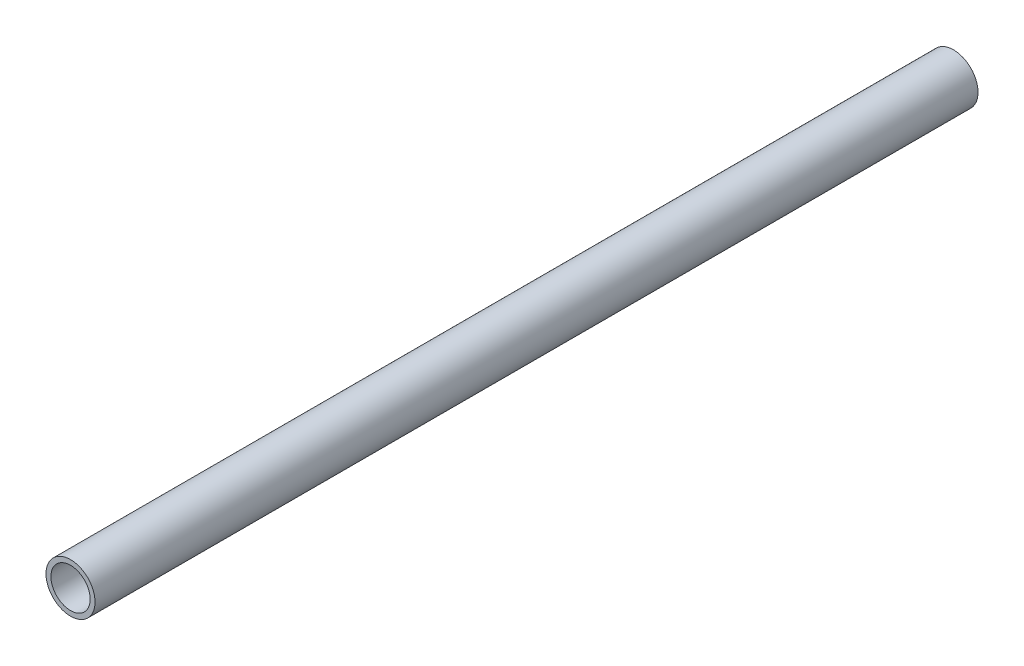
ISO-10303-21;
HEADER;
FILE_DESCRIPTION(('STEP AP214'),'2;1');
FILE_NAME('part.step','',(''),(''),'','','');
FILE_SCHEMA(('AUTOMOTIVE_DESIGN { 1 0 10303 214 1 1 1 1 }'));
ENDSEC;
DATA;
#1=APPLICATION_CONTEXT('core data for automotive mechanical design processes');
#2=APPLICATION_PROTOCOL_DEFINITION('international standard','automotive_design',2000,#1);
#3=PRODUCT_CONTEXT('',#1,'mechanical');
#4=PRODUCT('Part','Part','',(#3));
#5=PRODUCT_RELATED_PRODUCT_CATEGORY('part','',(#4));
#6=PRODUCT_DEFINITION_FORMATION('','',#4);
#7=PRODUCT_DEFINITION_CONTEXT('part definition',#1,'design');
#8=PRODUCT_DEFINITION('design','',#6,#7);
#9=PRODUCT_DEFINITION_SHAPE('','',#8);
#10=(LENGTH_UNIT() NAMED_UNIT(*) SI_UNIT(.MILLI.,.METRE.));
#11=(NAMED_UNIT(*) PLANE_ANGLE_UNIT() SI_UNIT($,.RADIAN.));
#12=(NAMED_UNIT(*) SI_UNIT($,.STERADIAN.) SOLID_ANGLE_UNIT());
#13=UNCERTAINTY_MEASURE_WITH_UNIT(LENGTH_MEASURE(1.E-05),#10,'distance_accuracy_value','');
#14=(GEOMETRIC_REPRESENTATION_CONTEXT(3) GLOBAL_UNCERTAINTY_ASSIGNED_CONTEXT((#13)) GLOBAL_UNIT_ASSIGNED_CONTEXT((#10,
#11,#12)) REPRESENTATION_CONTEXT('',''));
#15=CARTESIAN_POINT('',(0.,0.,0.));
#16=DIRECTION('',(0.,0.,1.));
#17=DIRECTION('',(1.,0.,0.));
#18=AXIS2_PLACEMENT_3D('',#15,#16,#17);
#19=CARTESIAN_POINT('',(0.,0.,180.));
#20=DIRECTION('',(0.,0.,1.));
#21=DIRECTION('',(1.,0.,0.));
#22=AXIS2_PLACEMENT_3D('',#19,#20,#21);
#23=PLANE('',#22);
#24=CARTESIAN_POINT('',(0.,0.,180.));
#25=DIRECTION('',(0.,0.,1.));
#26=DIRECTION('',(1.,0.,0.));
#27=AXIS2_PLACEMENT_3D('',#24,#25,#26);
#28=CIRCLE('',#27,5.);
#29=CARTESIAN_POINT('',(-5.,0.,180.));
#30=VERTEX_POINT('',#29);
#31=EDGE_CURVE('E10',#30,#30,#28,.T.);
#32=ORIENTED_EDGE('',*,*,#31,.T.);
#33=EDGE_LOOP('',(#32));
#34=FACE_BOUND('',#33,.T.);
#35=CARTESIAN_POINT('',(0.,0.,180.));
#36=DIRECTION('',(0.,0.,1.));
#37=DIRECTION('',(1.,0.,0.));
#38=AXIS2_PLACEMENT_3D('',#35,#36,#37);
#39=CIRCLE('',#38,4.);
#40=CARTESIAN_POINT('',(-4.,0.,180.));
#41=VERTEX_POINT('',#40);
#42=EDGE_CURVE('E44',#41,#41,#39,.T.);
#43=ORIENTED_EDGE('',*,*,#42,.F.);
#44=EDGE_LOOP('',(#43));
#45=FACE_BOUND('',#44,.T.);
#46=ADVANCED_FACE('F33',(#34,#45),#23,.T.);
#47=CARTESIAN_POINT('',(0.,0.,0.));
#48=DIRECTION('',(0.,0.,1.));
#49=DIRECTION('',(1.,0.,0.));
#50=AXIS2_PLACEMENT_3D('',#47,#48,#49);
#51=PLANE('',#50);
#52=CARTESIAN_POINT('',(0.,0.,0.));
#53=DIRECTION('',(0.,0.,1.));
#54=DIRECTION('',(1.,0.,0.));
#55=AXIS2_PLACEMENT_3D('',#52,#53,#54);
#56=CIRCLE('',#55,5.);
#57=CARTESIAN_POINT('',(-5.,0.,0.));
#58=VERTEX_POINT('',#57);
#59=EDGE_CURVE('E37',#58,#58,#56,.T.);
#60=ORIENTED_EDGE('',*,*,#59,.F.);
#61=EDGE_LOOP('',(#60));
#62=FACE_BOUND('',#61,.T.);
#63=CARTESIAN_POINT('',(0.,0.,0.));
#64=DIRECTION('',(0.,0.,1.));
#65=DIRECTION('',(1.,0.,0.));
#66=AXIS2_PLACEMENT_3D('',#63,#64,#65);
#67=CIRCLE('',#66,4.);
#68=CARTESIAN_POINT('',(-4.,0.,0.));
#69=VERTEX_POINT('',#68);
#70=EDGE_CURVE('E46',#69,#69,#67,.T.);
#71=ORIENTED_EDGE('',*,*,#70,.T.);
#72=EDGE_LOOP('',(#71));
#73=FACE_BOUND('',#72,.T.);
#74=ADVANCED_FACE('F56',(#62,#73),#51,.F.);
#75=CARTESIAN_POINT('',(0.,0.,180.));
#76=DIRECTION('',(0.,0.,-1.));
#77=DIRECTION('',(-1.,0.,0.));
#78=AXIS2_PLACEMENT_3D('',#75,#76,#77);
#79=CYLINDRICAL_SURFACE('',#78,5.);
#80=CARTESIAN_POINT('',(-5.,0.,180.));
#81=CARTESIAN_POINT('',(-5.,0.,178.125));
#82=CARTESIAN_POINT('',(-5.,0.,176.25));
#83=CARTESIAN_POINT('',(-5.,0.,172.5));
#84=CARTESIAN_POINT('',(-5.,0.,170.625));
#85=CARTESIAN_POINT('',(-5.,0.,166.875));
#86=CARTESIAN_POINT('',(-5.,0.,165.));
#87=CARTESIAN_POINT('',(-5.,0.,161.25));
#88=CARTESIAN_POINT('',(-5.,0.,159.375));
#89=CARTESIAN_POINT('',(-5.,0.,155.625));
#90=CARTESIAN_POINT('',(-5.,0.,153.75));
#91=CARTESIAN_POINT('',(-5.,0.,150.));
#92=CARTESIAN_POINT('',(-5.,0.,148.125));
#93=CARTESIAN_POINT('',(-5.,0.,144.375));
#94=CARTESIAN_POINT('',(-5.,0.,142.5));
#95=CARTESIAN_POINT('',(-5.,0.,138.75));
#96=CARTESIAN_POINT('',(-5.,0.,136.875));
#97=CARTESIAN_POINT('',(-5.,0.,133.125));
#98=CARTESIAN_POINT('',(-5.,0.,131.25));
#99=CARTESIAN_POINT('',(-5.,0.,127.5));
#100=CARTESIAN_POINT('',(-5.,0.,125.625));
#101=CARTESIAN_POINT('',(-5.,0.,121.875));
#102=CARTESIAN_POINT('',(-5.,0.,120.));
#103=CARTESIAN_POINT('',(-5.,0.,116.25));
#104=CARTESIAN_POINT('',(-5.,0.,114.375));
#105=CARTESIAN_POINT('',(-5.,0.,110.625));
#106=CARTESIAN_POINT('',(-5.,0.,108.75));
#107=CARTESIAN_POINT('',(-5.,0.,105.));
#108=CARTESIAN_POINT('',(-5.,0.,103.125));
#109=CARTESIAN_POINT('',(-5.,0.,99.375));
#110=CARTESIAN_POINT('',(-5.,0.,97.5));
#111=CARTESIAN_POINT('',(-5.,0.,93.75));
#112=CARTESIAN_POINT('',(-5.,0.,91.875));
#113=CARTESIAN_POINT('',(-5.,0.,88.125));
#114=CARTESIAN_POINT('',(-5.,0.,86.25));
#115=CARTESIAN_POINT('',(-5.,0.,82.5));
#116=CARTESIAN_POINT('',(-5.,0.,80.625));
#117=CARTESIAN_POINT('',(-5.,0.,76.875));
#118=CARTESIAN_POINT('',(-5.,0.,75.));
#119=CARTESIAN_POINT('',(-5.,0.,71.25));
#120=CARTESIAN_POINT('',(-5.,0.,69.375));
#121=CARTESIAN_POINT('',(-5.,0.,65.625));
#122=CARTESIAN_POINT('',(-5.,0.,63.75));
#123=CARTESIAN_POINT('',(-5.,0.,60.));
#124=CARTESIAN_POINT('',(-5.,0.,58.125));
#125=CARTESIAN_POINT('',(-5.,0.,54.375));
#126=CARTESIAN_POINT('',(-5.,0.,52.5));
#127=CARTESIAN_POINT('',(-5.,0.,48.75));
#128=CARTESIAN_POINT('',(-5.,0.,46.875));
#129=CARTESIAN_POINT('',(-5.,0.,43.125));
#130=CARTESIAN_POINT('',(-5.,0.,41.25));
#131=CARTESIAN_POINT('',(-5.,0.,37.5));
#132=CARTESIAN_POINT('',(-5.,0.,35.625));
#133=CARTESIAN_POINT('',(-5.,0.,31.875));
#134=CARTESIAN_POINT('',(-5.,0.,30.));
#135=CARTESIAN_POINT('',(-5.,0.,26.25));
#136=CARTESIAN_POINT('',(-5.,0.,24.375));
#137=CARTESIAN_POINT('',(-5.,0.,20.625));
#138=CARTESIAN_POINT('',(-5.,0.,18.75));
#139=CARTESIAN_POINT('',(-5.,0.,15.));
#140=CARTESIAN_POINT('',(-5.,0.,13.125));
#141=CARTESIAN_POINT('',(-5.,0.,9.37499999999998));
#142=CARTESIAN_POINT('',(-5.,0.,7.49999999999997));
#143=CARTESIAN_POINT('',(-5.,0.,3.74999999999997));
#144=CARTESIAN_POINT('',(-5.,0.,1.87499999999997));
#145=CARTESIAN_POINT('',(-5.,0.,0.));
#146=B_SPLINE_CURVE_WITH_KNOTS('',3,(#80,#81,#82,#83,#84,#85,#86,#87,#88,#89,#90,#91,#92,#93,
#94,#95,#96,#97,#98,#99,#100,#101,#102,#103,#104,#105,#106,#107,#108,#109,#110,#111,#112,#113,
#114,#115,#116,#117,#118,#119,#120,#121,#122,#123,#124,#125,#126,#127,#128,#129,#130,#131,#132,
#133,#134,#135,#136,#137,#138,#139,#140,#141,#142,#143,#144,#145),.UNSPECIFIED.,.F.,.F.,(4,2,2,
2,2,2,2,2,2,2,2,2,2,2,2,2,2,2,2,2,2,2,2,2,2,2,2,2,2,2,2,2,4),(0.,5.62500000000002,11.25,16.875,
22.5,28.125,33.75,39.375,45.,50.625,56.25,61.875,67.5,73.125,78.75,84.375,90.,95.625,101.25,
106.875,112.5,118.125,123.75,129.375,135.,140.625,146.25,151.875,157.5,163.125,168.75,174.375,
180.),.UNSPECIFIED.);
#147=EDGE_CURVE('BSEAM35',#30,#58,#146,.T.);
#148=ORIENTED_EDGE('',*,*,#31,.F.);
#149=ORIENTED_EDGE('',*,*,#59,.T.);
#150=ORIENTED_EDGE('',*,*,#147,.T.);
#151=ORIENTED_EDGE('',*,*,#147,.F.);
#152=EDGE_LOOP('',(#148,#150,#149,#151));
#153=FACE_BOUND('',#152,.T.);
#154=ADVANCED_FACE('F35',(#153),#79,.T.);
#155=CARTESIAN_POINT('',(0.,0.,180.));
#156=DIRECTION('',(0.,0.,-1.));
#157=DIRECTION('',(-1.,0.,0.));
#158=AXIS2_PLACEMENT_3D('',#155,#156,#157);
#159=CYLINDRICAL_SURFACE('',#158,4.);
#160=CARTESIAN_POINT('',(-4.,0.,180.));
#161=CARTESIAN_POINT('',(-4.,0.,178.125));
#162=CARTESIAN_POINT('',(-4.,0.,176.25));
#163=CARTESIAN_POINT('',(-4.,0.,172.5));
#164=CARTESIAN_POINT('',(-4.,0.,170.625));
#165=CARTESIAN_POINT('',(-4.,0.,166.875));
#166=CARTESIAN_POINT('',(-4.,0.,165.));
#167=CARTESIAN_POINT('',(-4.,0.,161.25));
#168=CARTESIAN_POINT('',(-4.,0.,159.375));
#169=CARTESIAN_POINT('',(-4.,0.,155.625));
#170=CARTESIAN_POINT('',(-4.,0.,153.75));
#171=CARTESIAN_POINT('',(-4.,0.,150.));
#172=CARTESIAN_POINT('',(-4.,0.,148.125));
#173=CARTESIAN_POINT('',(-4.,0.,144.375));
#174=CARTESIAN_POINT('',(-4.,0.,142.5));
#175=CARTESIAN_POINT('',(-4.,0.,138.75));
#176=CARTESIAN_POINT('',(-4.,0.,136.875));
#177=CARTESIAN_POINT('',(-4.,0.,133.125));
#178=CARTESIAN_POINT('',(-4.,0.,131.25));
#179=CARTESIAN_POINT('',(-4.,0.,127.5));
#180=CARTESIAN_POINT('',(-4.,0.,125.625));
#181=CARTESIAN_POINT('',(-4.,0.,121.875));
#182=CARTESIAN_POINT('',(-4.,0.,120.));
#183=CARTESIAN_POINT('',(-4.,0.,116.25));
#184=CARTESIAN_POINT('',(-4.,0.,114.375));
#185=CARTESIAN_POINT('',(-4.,0.,110.625));
#186=CARTESIAN_POINT('',(-4.,0.,108.75));
#187=CARTESIAN_POINT('',(-4.,0.,105.));
#188=CARTESIAN_POINT('',(-4.,0.,103.125));
#189=CARTESIAN_POINT('',(-4.,0.,99.375));
#190=CARTESIAN_POINT('',(-4.,0.,97.5));
#191=CARTESIAN_POINT('',(-4.,0.,93.75));
#192=CARTESIAN_POINT('',(-4.,0.,91.875));
#193=CARTESIAN_POINT('',(-4.,0.,88.125));
#194=CARTESIAN_POINT('',(-4.,0.,86.25));
#195=CARTESIAN_POINT('',(-4.,0.,82.5));
#196=CARTESIAN_POINT('',(-4.,0.,80.625));
#197=CARTESIAN_POINT('',(-4.,0.,76.875));
#198=CARTESIAN_POINT('',(-4.,0.,75.));
#199=CARTESIAN_POINT('',(-4.,0.,71.25));
#200=CARTESIAN_POINT('',(-4.,0.,69.375));
#201=CARTESIAN_POINT('',(-4.,0.,65.625));
#202=CARTESIAN_POINT('',(-4.,0.,63.75));
#203=CARTESIAN_POINT('',(-4.,0.,60.));
#204=CARTESIAN_POINT('',(-4.,0.,58.125));
#205=CARTESIAN_POINT('',(-4.,0.,54.375));
#206=CARTESIAN_POINT('',(-4.,0.,52.5));
#207=CARTESIAN_POINT('',(-4.,0.,48.75));
#208=CARTESIAN_POINT('',(-4.,0.,46.875));
#209=CARTESIAN_POINT('',(-4.,0.,43.125));
#210=CARTESIAN_POINT('',(-4.,0.,41.25));
#211=CARTESIAN_POINT('',(-4.,0.,37.5));
#212=CARTESIAN_POINT('',(-4.,0.,35.625));
#213=CARTESIAN_POINT('',(-4.,0.,31.875));
#214=CARTESIAN_POINT('',(-4.,0.,30.));
#215=CARTESIAN_POINT('',(-4.,0.,26.25));
#216=CARTESIAN_POINT('',(-4.,0.,24.375));
#217=CARTESIAN_POINT('',(-4.,0.,20.625));
#218=CARTESIAN_POINT('',(-4.,0.,18.75));
#219=CARTESIAN_POINT('',(-4.,0.,15.));
#220=CARTESIAN_POINT('',(-4.,0.,13.125));
#221=CARTESIAN_POINT('',(-4.,0.,9.37499999999998));
#222=CARTESIAN_POINT('',(-4.,0.,7.49999999999997));
#223=CARTESIAN_POINT('',(-4.,0.,3.74999999999997));
#224=CARTESIAN_POINT('',(-4.,0.,1.87499999999997));
#225=CARTESIAN_POINT('',(-4.,0.,0.));
#226=B_SPLINE_CURVE_WITH_KNOTS('',3,(#160,#161,#162,#163,#164,#165,#166,#167,#168,#169,#170,
#171,#172,#173,#174,#175,#176,#177,#178,#179,#180,#181,#182,#183,#184,#185,#186,#187,#188,#189,
#190,#191,#192,#193,#194,#195,#196,#197,#198,#199,#200,#201,#202,#203,#204,#205,#206,#207,#208,
#209,#210,#211,#212,#213,#214,#215,#216,#217,#218,#219,#220,#221,#222,#223,#224,#225),
.UNSPECIFIED.,.F.,.F.,(4,2,2,2,2,2,2,2,2,2,2,2,2,2,2,2,2,2,2,2,2,2,2,2,2,2,2,2,2,2,2,2,4),(0.,
5.62499999999999,11.25,16.875,22.5,28.125,33.75,39.375,45.,50.625,56.25,61.875,67.5,73.125,
78.75,84.375,90.,95.625,101.25,106.875,112.5,118.125,123.75,129.375,135.,140.625,146.25,151.875,
157.5,163.125,168.75,174.375,180.),.UNSPECIFIED.);
#227=EDGE_CURVE('BSEAM52',#41,#69,#226,.T.);
#228=ORIENTED_EDGE('',*,*,#42,.T.);
#229=ORIENTED_EDGE('',*,*,#70,.F.);
#230=ORIENTED_EDGE('',*,*,#227,.T.);
#231=ORIENTED_EDGE('',*,*,#227,.F.);
#232=EDGE_LOOP('',(#228,#230,#229,#231));
#233=FACE_BOUND('',#232,.T.);
#234=ADVANCED_FACE('F52',(#233),#159,.F.);
#235=CLOSED_SHELL('',(#46,#74,#154,#234));
#236=MANIFOLD_SOLID_BREP('B2',#235);
#237=ADVANCED_BREP_SHAPE_REPRESENTATION('',(#18,#236),#14);
#238=SHAPE_DEFINITION_REPRESENTATION(#9,#237);
ENDSEC;
END-ISO-10303-21;
